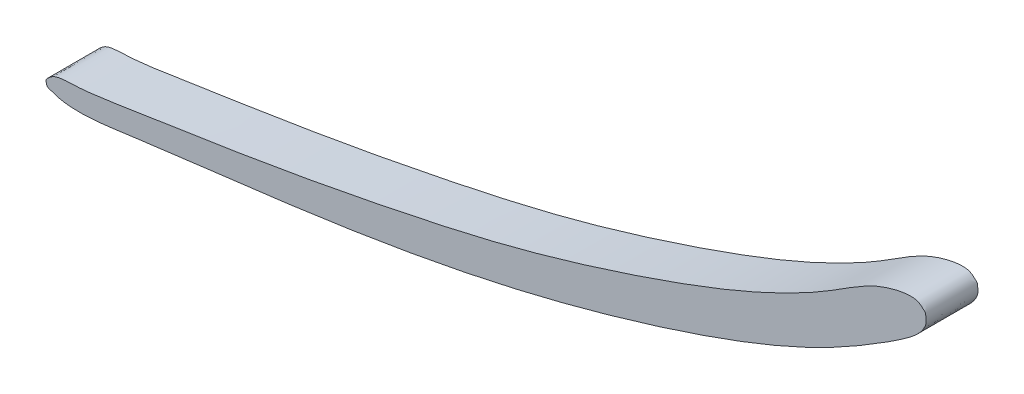
ISO-10303-21;
HEADER;
FILE_DESCRIPTION(('STEP AP214'),'2;1');
FILE_NAME('part.step','',(''),(''),'','','');
FILE_SCHEMA(('AUTOMOTIVE_DESIGN { 1 0 10303 214 1 1 1 1 }'));
ENDSEC;
DATA;
#1=APPLICATION_CONTEXT('core data for automotive mechanical design processes');
#2=APPLICATION_PROTOCOL_DEFINITION('international standard','automotive_design',2000,#1);
#3=PRODUCT_CONTEXT('',#1,'mechanical');
#4=PRODUCT('Part','Part','',(#3));
#5=PRODUCT_RELATED_PRODUCT_CATEGORY('part','',(#4));
#6=PRODUCT_DEFINITION_FORMATION('','',#4);
#7=PRODUCT_DEFINITION_CONTEXT('part definition',#1,'design');
#8=PRODUCT_DEFINITION('design','',#6,#7);
#9=PRODUCT_DEFINITION_SHAPE('','',#8);
#10=(LENGTH_UNIT() NAMED_UNIT(*) SI_UNIT(.MILLI.,.METRE.));
#11=(NAMED_UNIT(*) PLANE_ANGLE_UNIT() SI_UNIT($,.RADIAN.));
#12=(NAMED_UNIT(*) SI_UNIT($,.STERADIAN.) SOLID_ANGLE_UNIT());
#13=UNCERTAINTY_MEASURE_WITH_UNIT(LENGTH_MEASURE(1.E-05),#10,'distance_accuracy_value','');
#14=(GEOMETRIC_REPRESENTATION_CONTEXT(3) GLOBAL_UNCERTAINTY_ASSIGNED_CONTEXT((#13)) GLOBAL_UNIT_ASSIGNED_CONTEXT((#10,
#11,#12)) REPRESENTATION_CONTEXT('',''));
#15=CARTESIAN_POINT('',(0.,0.,0.));
#16=DIRECTION('',(0.,0.,1.));
#17=DIRECTION('',(1.,0.,0.));
#18=AXIS2_PLACEMENT_3D('',#15,#16,#17);
#19=CARTESIAN_POINT('',(81.9546405820367,0.,316.));
#20=CARTESIAN_POINT('',(81.9182748863016,0.089243312207409,316.));
#21=CARTESIAN_POINT('',(81.8518161970342,0.158823015412697,316.));
#22=CARTESIAN_POINT('',(81.7140613273951,0.28980377412269,316.));
#23=CARTESIAN_POINT('',(81.6414077026254,0.351049892688419,316.));
#24=CARTESIAN_POINT('',(81.4273001364999,0.539119186460483,316.));
#25=CARTESIAN_POINT('',(81.2851102193728,0.666832228059657,316.));
#26=CARTESIAN_POINT('',(81.0541309459078,0.830339589560085,316.));
#27=CARTESIAN_POINT('',(80.9746396369831,0.880572125893839,316.));
#28=CARTESIAN_POINT('',(80.8066057316116,0.965566869492166,316.));
#29=CARTESIAN_POINT('',(80.7176492036525,1.00096591970116,316.));
#30=CARTESIAN_POINT('',(80.4442176868888,1.0865491488962,316.));
#31=CARTESIAN_POINT('',(80.257755446291,1.11568194798233,316.));
#32=CARTESIAN_POINT('',(79.8807960284188,1.14695878573351,316.));
#33=CARTESIAN_POINT('',(79.6897614554825,1.14825299362697,316.));
#34=CARTESIAN_POINT('',(79.3121434621591,1.1369019626033,316.));
#35=CARTESIAN_POINT('',(79.1244636799543,1.12376938458255,316.));
#36=CARTESIAN_POINT('',(78.5644534405324,1.06436815026517,316.));
#37=CARTESIAN_POINT('',(78.1948995007169,0.999764036346694,316.));
#38=CARTESIAN_POINT('',(77.0917144194995,0.769784623696374,316.));
#39=CARTESIAN_POINT('',(76.3630574915217,0.562113818002702,316.));
#40=CARTESIAN_POINT('',(74.9508314190548,0.0730764678105502,316.));
#41=CARTESIAN_POINT('',(74.26363608331,-0.211904237510834,316.));
#42=CARTESIAN_POINT('',(72.2564212772526,-1.18313792848577,316.));
#43=CARTESIAN_POINT('',(70.9856052221877,-1.97567169653404,316.));
#44=CARTESIAN_POINT('',(69.0891814086041,-3.18155194632378,316.));
#45=CARTESIAN_POINT('',(68.4578603753768,-3.58501458001692,316.));
#46=CARTESIAN_POINT('',(67.1870663139028,-4.37700664007789,316.));
#47=CARTESIAN_POINT('',(66.5482682396617,-4.76677247889148,316.));
#48=CARTESIAN_POINT('',(64.6136481066863,-5.90268291697414,316.));
#49=CARTESIAN_POINT('',(63.3003898823765,-6.61688712927297,316.));
#50=CARTESIAN_POINT('',(60.6423566265034,-7.98756158619398,316.));
#51=CARTESIAN_POINT('',(59.2977079012692,-8.64426320468175,316.));
#52=CARTESIAN_POINT('',(56.5850021916112,-9.91478609313226,316.));
#53=CARTESIAN_POINT('',(55.2161519692049,-10.5275094282811,316.));
#54=CARTESIAN_POINT('',(52.4607548526107,-11.7063218833299,316.));
#55=CARTESIAN_POINT('',(51.0737063189857,-12.2734188886772,316.));
#56=CARTESIAN_POINT('',(46.8904747757466,-13.9220124185865,316.));
#57=CARTESIAN_POINT('',(44.076698288708,-14.9539924601354,316.));
#58=CARTESIAN_POINT('',(38.4208123807373,-16.9342289141329,316.));
#59=CARTESIAN_POINT('',(35.5768772184751,-17.8804869938995,316.));
#60=CARTESIAN_POINT('',(29.8655084025482,-19.69971173678,316.));
#61=CARTESIAN_POINT('',(26.9989195894682,-20.5722516853524,316.));
#62=CARTESIAN_POINT('',(21.2370655887499,-22.2198386268903,316.));
#63=CARTESIAN_POINT('',(18.3401274905242,-22.9927702561316,316.));
#64=CARTESIAN_POINT('',(12.5221282133524,-24.4330477982873,316.));
#65=CARTESIAN_POINT('',(9.60111202208722,-25.1014490657933,316.));
#66=CARTESIAN_POINT('',(3.74485255911519,-26.3769966265363,316.));
#67=CARTESIAN_POINT('',(0.810059324670765,-26.9864102959573,316.));
#68=CARTESIAN_POINT('',(-5.06636521183211,-28.1671176099954,316.));
#69=CARTESIAN_POINT('',(-8.00870948889032,-28.7364400779835,316.));
#70=CARTESIAN_POINT('',(-13.9023139259415,-29.8297047574911,316.));
#71=CARTESIAN_POINT('',(-16.8539693829938,-30.3499524586221,316.));
#72=CARTESIAN_POINT('',(-22.7644107992125,-31.3459919273104,316.));
#73=CARTESIAN_POINT('',(-25.7234844405557,-31.8211740457049,316.));
#74=CARTESIAN_POINT('',(-31.64517907339,-32.7502079600499,316.));
#75=CARTESIAN_POINT('',(-34.6072705800471,-33.2067619149209,316.));
#76=CARTESIAN_POINT('',(-39.0513443409814,-33.8854239793102,316.));
#77=CARTESIAN_POINT('',(-40.5329354700353,-34.1101506712477,316.));
#78=CARTESIAN_POINT('',(-42.7565096618807,-34.4392211476341,316.));
#79=CARTESIAN_POINT('',(-43.4978561517697,-34.5478895747197,316.));
#80=CARTESIAN_POINT('',(-44.9807394355377,-34.7638317834205,316.));
#81=CARTESIAN_POINT('',(-45.7223704155188,-34.8702725433276,316.));
#82=CARTESIAN_POINT('',(-47.2099154760837,-35.0485354665235,316.));
#83=CARTESIAN_POINT('',(-47.9563384145035,-35.1189865169633,316.));
#84=CARTESIAN_POINT('',(-49.0791279025362,-35.1869540484841,316.));
#85=CARTESIAN_POINT('',(-49.4541056796109,-35.2008332247413,316.));
#86=CARTESIAN_POINT('',(-50.2041050596801,-35.2280533211948,316.));
#87=CARTESIAN_POINT('',(-50.578902186492,-35.2441511867357,316.));
#88=CARTESIAN_POINT('',(-51.1387937127097,-35.2965969971684,316.));
#89=CARTESIAN_POINT('',(-51.3250580091422,-35.3185766374869,316.));
#90=CARTESIAN_POINT('',(-51.6962975668631,-35.3783674393037,316.));
#91=CARTESIAN_POINT('',(-51.8824258111486,-35.4168378541217,316.));
#92=CARTESIAN_POINT('',(-52.2463123768913,-35.5219532779401,316.));
#93=CARTESIAN_POINT('',(-52.4230074837365,-35.5882609488944,316.));
#94=CARTESIAN_POINT('',(-52.7606039163099,-35.7622552084388,316.));
#95=CARTESIAN_POINT('',(-52.918061103166,-35.8692218489668,316.));
#96=CARTESIAN_POINT('',(-53.1415131522069,-36.0435522658209,316.));
#97=CARTESIAN_POINT('',(-53.2136646977764,-36.1047903655575,316.));
#98=CARTESIAN_POINT('',(-53.3570929981775,-36.2284397034681,316.));
#99=CARTESIAN_POINT('',(-53.4293280627828,-36.2899539624756,316.));
#100=CARTESIAN_POINT('',(-53.5648051688221,-36.4218927887926,316.));
#101=CARTESIAN_POINT('',(-53.6312600227741,-36.4927538659897,316.));
#102=CARTESIAN_POINT('',(-53.7094628584896,-36.6645865581047,316.));
#103=CARTESIAN_POINT('',(-53.7137862045524,-36.7640328475197,316.));
#104=CARTESIAN_POINT('',(-53.6918197112169,-36.951135913176,316.));
#105=CARTESIAN_POINT('',(-53.6695753615207,-37.0422509078683,316.));
#106=CARTESIAN_POINT('',(-53.6180091447266,-37.2229495516098,316.));
#107=CARTESIAN_POINT('',(-53.5876519694081,-37.3133451174461,316.));
#108=CARTESIAN_POINT('',(-53.4881675673286,-37.4738966928527,316.));
#109=CARTESIAN_POINT('',(-53.4143216159522,-37.5388870191155,316.));
#110=CARTESIAN_POINT('',(-53.2445843828593,-37.6183572854478,316.));
#111=CARTESIAN_POINT('',(-53.1517814998787,-37.6406610261997,316.));
#112=CARTESIAN_POINT('',(-52.8786158688037,-37.7161915074091,316.));
#113=CARTESIAN_POINT('',(-52.6985739208244,-37.7732157035082,316.));
#114=CARTESIAN_POINT('',(-52.3408840894491,-37.894984626883,316.));
#115=CARTESIAN_POINT('',(-52.1623456221943,-37.9572349471845,316.));
#116=CARTESIAN_POINT('',(-51.6224224525606,-38.1201296416042,316.));
#117=CARTESIAN_POINT('',(-51.2564349398305,-38.194565698396,316.));
#118=CARTESIAN_POINT('',(-50.5177985076247,-38.3057550131267,316.));
#119=CARTESIAN_POINT('',(-50.1454426264057,-38.3441659542109,316.));
#120=CARTESIAN_POINT('',(-49.396792019221,-38.3987062523276,316.));
#121=CARTESIAN_POINT('',(-49.0206958101248,-38.4133646020394,316.));
#122=CARTESIAN_POINT('',(-47.8971625980423,-38.4237892955912,316.));
#123=CARTESIAN_POINT('',(-47.1507676794142,-38.3854628749226,316.));
#124=CARTESIAN_POINT('',(-45.6605345267884,-38.2647494353492,316.));
#125=CARTESIAN_POINT('',(-44.9166266074145,-38.1835633386593,316.));
#126=CARTESIAN_POINT('',(-42.6864719270234,-37.9129643636809,316.));
#127=CARTESIAN_POINT('',(-41.2032124696045,-37.7031991413411,316.));
#128=CARTESIAN_POINT('',(-38.2352272508575,-37.297415798383,316.));
#129=CARTESIAN_POINT('',(-36.7506967263939,-37.0986577341135,316.));
#130=CARTESIAN_POINT('',(-32.2941491778163,-36.5250987254802,316.));
#131=CARTESIAN_POINT('',(-29.3196978320326,-36.1690084095844,316.));
#132=CARTESIAN_POINT('',(-23.3721065437422,-35.4467611871817,316.));
#133=CARTESIAN_POINT('',(-20.3989508292782,-35.0806988714863,316.));
#134=CARTESIAN_POINT('',(-11.4880914751171,-33.9160806763925,316.));
#135=CARTESIAN_POINT('',(-5.55767157625974,-33.0502360842342,316.));
#136=CARTESIAN_POINT('',(6.25061971561724,-31.0320649081213,316.));
#137=CARTESIAN_POINT('',(12.1331890129808,-29.8825999895087,316.));
#138=CARTESIAN_POINT('',(23.8163007385662,-27.2176492195766,316.));
#139=CARTESIAN_POINT('',(29.6172490807749,-25.7011080353402,316.));
#140=CARTESIAN_POINT('',(38.2406645762647,-23.171772680002,316.));
#141=CARTESIAN_POINT('',(41.1014914808218,-22.2871241603912,316.));
#142=CARTESIAN_POINT('',(46.7930028004942,-20.4260699020948,316.));
#143=CARTESIAN_POINT('',(49.6236881394778,-19.4496669757709,316.));
#144=CARTESIAN_POINT('',(55.2404000871695,-17.3609147904409,316.));
#145=CARTESIAN_POINT('',(58.0245333898623,-16.2492782869261,316.));
#146=CARTESIAN_POINT('',(63.5035986793167,-13.8252918273535,316.));
#147=CARTESIAN_POINT('',(66.2001991823123,-12.5099449999535,316.));
#148=CARTESIAN_POINT('',(71.4667487740549,-9.64830298934935,316.));
#149=CARTESIAN_POINT('',(74.0386839902692,-8.10252610514831,316.));
#150=CARTESIAN_POINT('',(77.1826155149788,-6.06335085918845,316.));
#151=CARTESIAN_POINT('',(77.8081278326848,-5.65003968220255,316.));
#152=CARTESIAN_POINT('',(78.7320229738586,-5.00978704513141,316.));
#153=CARTESIAN_POINT('',(79.0370378318316,-4.79218083479674,316.));
#154=CARTESIAN_POINT('',(79.6370462210264,-4.34274018134626,316.));
#155=CARTESIAN_POINT('',(79.9322908925766,-4.11185112899191,316.));
#156=CARTESIAN_POINT('',(80.4987500584054,-3.62524435154558,316.));
#157=CARTESIAN_POINT('',(80.7702540175255,-3.36938112538204,316.));
#158=CARTESIAN_POINT('',(81.2725352019993,-2.81403045616466,316.));
#159=CARTESIAN_POINT('',(81.5023709687073,-2.51150877752152,316.));
#160=CARTESIAN_POINT('',(81.7830396426459,-2.0248548901506,316.));
#161=CARTESIAN_POINT('',(81.8672725857317,-1.85588105863238,316.));
#162=CARTESIAN_POINT('',(81.999105231837,-1.5013745114067,316.));
#163=CARTESIAN_POINT('',(82.0463519176487,-1.31982068387867,316.));
#164=CARTESIAN_POINT('',(82.0716351434549,-0.940770460698717,316.));
#165=CARTESIAN_POINT('',(82.0458641107979,-0.751092051566451,316.));
#166=CARTESIAN_POINT('',(82.0124105837043,-0.468344785746741,316.));
#167=CARTESIAN_POINT('',(82.005397647586,-0.373782145218598,316.));
#168=CARTESIAN_POINT('',(81.993306477084,-0.184510272976822,316.));
#169=CARTESIAN_POINT('',(81.9910062777718,-0.0892433122073938,316.));
#170=CARTESIAN_POINT('',(81.9546405820367,0.,316.));
#171=B_SPLINE_CURVE_WITH_KNOTS('',3,(#19,#20,#21,#22,#23,#24,#25,#26,#27,#28,#29,#30,#31,#32,
#33,#34,#35,#36,#37,#38,#39,#40,#41,#42,#43,#44,#45,#46,#47,#48,#49,#50,#51,#52,#53,#54,#55,#56,
#57,#58,#59,#60,#61,#62,#63,#64,#65,#66,#67,#68,#69,#70,#71,#72,#73,#74,#75,#76,#77,#78,#79,#80,
#81,#82,#83,#84,#85,#86,#87,#88,#89,#90,#91,#92,#93,#94,#95,#96,#97,#98,#99,#100,#101,#102,#103,
#104,#105,#106,#107,#108,#109,#110,#111,#112,#113,#114,#115,#116,#117,#118,#119,#120,#121,#122,
#123,#124,#125,#126,#127,#128,#129,#130,#131,#132,#133,#134,#135,#136,#137,#138,#139,#140,#141,
#142,#143,#144,#145,#146,#147,#148,#149,#150,#151,#152,#153,#154,#155,#156,#157,#158,#159,#160,
#161,#162,#163,#164,#165,#166,#167,#168,#169,#170),.UNSPECIFIED.,.T.,.F.,(4,2,2,2,2,2,2,2,2,2,2,
2,2,2,2,2,2,2,2,2,2,2,2,2,2,2,2,2,2,2,2,2,2,2,2,2,2,2,2,2,2,2,2,2,2,2,2,2,2,2,2,2,2,2,2,2,2,2,2,
2,2,2,2,2,2,2,2,2,2,2,2,2,2,2,2,4),(0.,0.000976562500000057,0.00195312500000011,
0.00390625000000023,0.00488281250000028,0.00585937500000034,0.00781250000000045,
0.00976562500000057,0.0117187500000007,0.0156250000000008,0.0234375000000008,0.0312500000000008,
0.0468750000000009,0.0546875000000009,0.0625000000000009,0.0781250000000011,0.0937500000000013,
0.109375000000002,0.125000000000002,0.156250000000002,0.187500000000003,0.218750000000003,
0.250000000000004,0.281250000000004,0.312500000000005,0.343750000000005,0.375000000000005,
0.406250000000006,0.437500000000006,0.453125000000007,0.460937500000007,0.468750000000007,
0.476562500000007,0.480468750000007,0.484375000000007,0.486328125000007,0.488281250000007,
0.490234375000007,0.492187500000007,0.493164062500007,0.494140625000007,0.495117187500007,
0.496093750000006,0.497070312500006,0.498046875000006,0.499023437500006,0.500000000000006,
0.501953125000006,0.503906250000006,0.507812500000006,0.511718750000006,0.515625000000006,
0.523437500000006,0.531250000000006,0.546875000000006,0.562500000000006,0.593750000000005,
0.625000000000005,0.687500000000004,0.750000000000003,0.812500000000002,0.843750000000002,
0.875000000000001,0.906250000000001,0.9375,0.96875,0.9765625,0.98046875,0.984375,0.98828125,
0.9921875,0.994140625,0.99609375,0.998046875,0.9990234375,1.),.UNSPECIFIED.);
#172=DIRECTION('',(0.,0.,-1.));
#173=VECTOR('',#172,1.);
#174=SURFACE_OF_LINEAR_EXTRUSION('',#171,#173);
#175=CARTESIAN_POINT('',(81.9546405820367,0.,316.));
#176=CARTESIAN_POINT('',(81.9910062777718,-0.0892433122073938,316.));
#177=CARTESIAN_POINT('',(81.993306477084,-0.184510272976822,316.));
#178=CARTESIAN_POINT('',(82.005397647586,-0.373782145218598,316.));
#179=CARTESIAN_POINT('',(82.0124105837043,-0.468344785746741,316.));
#180=CARTESIAN_POINT('',(82.0458641107979,-0.751092051566451,316.));
#181=CARTESIAN_POINT('',(82.0716351434549,-0.940770460698717,316.));
#182=CARTESIAN_POINT('',(82.0463519176487,-1.31982068387867,316.));
#183=CARTESIAN_POINT('',(81.999105231837,-1.5013745114067,316.));
#184=CARTESIAN_POINT('',(81.8672725857317,-1.85588105863238,316.));
#185=CARTESIAN_POINT('',(81.7830396426459,-2.0248548901506,316.));
#186=CARTESIAN_POINT('',(81.5023709687073,-2.51150877752152,316.));
#187=CARTESIAN_POINT('',(81.2725352019993,-2.81403045616466,316.));
#188=CARTESIAN_POINT('',(80.7702540175255,-3.36938112538204,316.));
#189=CARTESIAN_POINT('',(80.4987500584054,-3.62524435154558,316.));
#190=CARTESIAN_POINT('',(79.9322908925766,-4.11185112899191,316.));
#191=CARTESIAN_POINT('',(79.6370462210264,-4.34274018134626,316.));
#192=CARTESIAN_POINT('',(79.0370378318316,-4.79218083479674,316.));
#193=CARTESIAN_POINT('',(78.7320229738586,-5.00978704513141,316.));
#194=CARTESIAN_POINT('',(77.8081278326848,-5.65003968220255,316.));
#195=CARTESIAN_POINT('',(77.1826155149788,-6.06335085918845,316.));
#196=CARTESIAN_POINT('',(74.0386839902692,-8.10252610514831,316.));
#197=CARTESIAN_POINT('',(71.4667487740549,-9.64830298934935,316.));
#198=CARTESIAN_POINT('',(66.2001991823123,-12.5099449999535,316.));
#199=CARTESIAN_POINT('',(63.5035986793167,-13.8252918273535,316.));
#200=CARTESIAN_POINT('',(58.0245333898623,-16.2492782869261,316.));
#201=CARTESIAN_POINT('',(55.2404000871695,-17.3609147904409,316.));
#202=CARTESIAN_POINT('',(49.6236881394778,-19.4496669757709,316.));
#203=CARTESIAN_POINT('',(46.7930028004942,-20.4260699020948,316.));
#204=CARTESIAN_POINT('',(41.1014914808218,-22.2871241603912,316.));
#205=CARTESIAN_POINT('',(38.2406645762647,-23.171772680002,316.));
#206=CARTESIAN_POINT('',(29.6172490807749,-25.7011080353402,316.));
#207=CARTESIAN_POINT('',(23.8163007385662,-27.2176492195766,316.));
#208=CARTESIAN_POINT('',(12.1331890129808,-29.8825999895087,316.));
#209=CARTESIAN_POINT('',(6.25061971561724,-31.0320649081213,316.));
#210=CARTESIAN_POINT('',(-5.55767157625974,-33.0502360842342,316.));
#211=CARTESIAN_POINT('',(-11.4880914751171,-33.9160806763925,316.));
#212=CARTESIAN_POINT('',(-20.3989508292782,-35.0806988714863,316.));
#213=CARTESIAN_POINT('',(-23.3721065437422,-35.4467611871817,316.));
#214=CARTESIAN_POINT('',(-29.3196978320326,-36.1690084095844,316.));
#215=CARTESIAN_POINT('',(-32.2941491778163,-36.5250987254802,316.));
#216=CARTESIAN_POINT('',(-36.7506967263939,-37.0986577341135,316.));
#217=CARTESIAN_POINT('',(-38.2352272508575,-37.297415798383,316.));
#218=CARTESIAN_POINT('',(-41.2032124696045,-37.7031991413411,316.));
#219=CARTESIAN_POINT('',(-42.6864719270234,-37.9129643636809,316.));
#220=CARTESIAN_POINT('',(-44.9166266074145,-38.1835633386593,316.));
#221=CARTESIAN_POINT('',(-45.6605345267884,-38.2647494353492,316.));
#222=CARTESIAN_POINT('',(-47.1507676794142,-38.3854628749226,316.));
#223=CARTESIAN_POINT('',(-47.8971625980423,-38.4237892955912,316.));
#224=CARTESIAN_POINT('',(-49.0206958101248,-38.4133646020394,316.));
#225=CARTESIAN_POINT('',(-49.396792019221,-38.3987062523276,316.));
#226=CARTESIAN_POINT('',(-50.1454426264057,-38.3441659542109,316.));
#227=CARTESIAN_POINT('',(-50.5177985076247,-38.3057550131267,316.));
#228=CARTESIAN_POINT('',(-51.2564349398305,-38.194565698396,316.));
#229=CARTESIAN_POINT('',(-51.6224224525606,-38.1201296416042,316.));
#230=CARTESIAN_POINT('',(-52.1623456221943,-37.9572349471845,316.));
#231=CARTESIAN_POINT('',(-52.3408840894491,-37.894984626883,316.));
#232=CARTESIAN_POINT('',(-52.6985739208244,-37.7732157035082,316.));
#233=CARTESIAN_POINT('',(-52.8786158688037,-37.7161915074091,316.));
#234=CARTESIAN_POINT('',(-53.1517814998787,-37.6406610261997,316.));
#235=CARTESIAN_POINT('',(-53.2445843828593,-37.6183572854478,316.));
#236=CARTESIAN_POINT('',(-53.4143216159522,-37.5388870191155,316.));
#237=CARTESIAN_POINT('',(-53.4881675673286,-37.4738966928527,316.));
#238=CARTESIAN_POINT('',(-53.5876519694081,-37.3133451174461,316.));
#239=CARTESIAN_POINT('',(-53.6180091447266,-37.2229495516098,316.));
#240=CARTESIAN_POINT('',(-53.6695753615207,-37.0422509078683,316.));
#241=CARTESIAN_POINT('',(-53.6918197112169,-36.951135913176,316.));
#242=CARTESIAN_POINT('',(-53.7137862045524,-36.7640328475197,316.));
#243=CARTESIAN_POINT('',(-53.7094628584896,-36.6645865581047,316.));
#244=CARTESIAN_POINT('',(-53.6312600227741,-36.4927538659897,316.));
#245=CARTESIAN_POINT('',(-53.5648051688221,-36.4218927887926,316.));
#246=CARTESIAN_POINT('',(-53.4293280627828,-36.2899539624756,316.));
#247=CARTESIAN_POINT('',(-53.3570929981775,-36.2284397034681,316.));
#248=CARTESIAN_POINT('',(-53.2136646977764,-36.1047903655575,316.));
#249=CARTESIAN_POINT('',(-53.1415131522069,-36.0435522658209,316.));
#250=CARTESIAN_POINT('',(-52.918061103166,-35.8692218489668,316.));
#251=CARTESIAN_POINT('',(-52.7606039163099,-35.7622552084388,316.));
#252=CARTESIAN_POINT('',(-52.4230074837365,-35.5882609488944,316.));
#253=CARTESIAN_POINT('',(-52.2463123768913,-35.5219532779401,316.));
#254=CARTESIAN_POINT('',(-51.8824258111486,-35.4168378541217,316.));
#255=CARTESIAN_POINT('',(-51.6962975668631,-35.3783674393037,316.));
#256=CARTESIAN_POINT('',(-51.3250580091422,-35.3185766374869,316.));
#257=CARTESIAN_POINT('',(-51.1387937127097,-35.2965969971684,316.));
#258=CARTESIAN_POINT('',(-50.578902186492,-35.2441511867357,316.));
#259=CARTESIAN_POINT('',(-50.2041050596801,-35.2280533211948,316.));
#260=CARTESIAN_POINT('',(-49.4541056796109,-35.2008332247413,316.));
#261=CARTESIAN_POINT('',(-49.0791279025362,-35.1869540484841,316.));
#262=CARTESIAN_POINT('',(-47.9563384145035,-35.1189865169633,316.));
#263=CARTESIAN_POINT('',(-47.2099154760837,-35.0485354665235,316.));
#264=CARTESIAN_POINT('',(-45.7223704155188,-34.8702725433276,316.));
#265=CARTESIAN_POINT('',(-44.9807394355377,-34.7638317834205,316.));
#266=CARTESIAN_POINT('',(-43.4978561517697,-34.5478895747197,316.));
#267=CARTESIAN_POINT('',(-42.7565096618807,-34.4392211476341,316.));
#268=CARTESIAN_POINT('',(-40.5329354700353,-34.1101506712477,316.));
#269=CARTESIAN_POINT('',(-39.0513443409814,-33.8854239793102,316.));
#270=CARTESIAN_POINT('',(-34.6072705800471,-33.2067619149209,316.));
#271=CARTESIAN_POINT('',(-31.64517907339,-32.7502079600499,316.));
#272=CARTESIAN_POINT('',(-25.7234844405557,-31.8211740457049,316.));
#273=CARTESIAN_POINT('',(-22.7644107992125,-31.3459919273104,316.));
#274=CARTESIAN_POINT('',(-16.8539693829938,-30.3499524586221,316.));
#275=CARTESIAN_POINT('',(-13.9023139259415,-29.8297047574911,316.));
#276=CARTESIAN_POINT('',(-8.00870948889032,-28.7364400779835,316.));
#277=CARTESIAN_POINT('',(-5.06636521183211,-28.1671176099954,316.));
#278=CARTESIAN_POINT('',(0.810059324670765,-26.9864102959573,316.));
#279=CARTESIAN_POINT('',(3.74485255911519,-26.3769966265363,316.));
#280=CARTESIAN_POINT('',(9.60111202208722,-25.1014490657933,316.));
#281=CARTESIAN_POINT('',(12.5221282133524,-24.4330477982873,316.));
#282=CARTESIAN_POINT('',(18.3401274905242,-22.9927702561316,316.));
#283=CARTESIAN_POINT('',(21.2370655887499,-22.2198386268903,316.));
#284=CARTESIAN_POINT('',(26.9989195894682,-20.5722516853524,316.));
#285=CARTESIAN_POINT('',(29.8655084025482,-19.69971173678,316.));
#286=CARTESIAN_POINT('',(35.5768772184751,-17.8804869938995,316.));
#287=CARTESIAN_POINT('',(38.4208123807373,-16.9342289141329,316.));
#288=CARTESIAN_POINT('',(44.076698288708,-14.9539924601354,316.));
#289=CARTESIAN_POINT('',(46.8904747757466,-13.9220124185865,316.));
#290=CARTESIAN_POINT('',(51.0737063189857,-12.2734188886772,316.));
#291=CARTESIAN_POINT('',(52.4607548526107,-11.7063218833299,316.));
#292=CARTESIAN_POINT('',(55.2161519692049,-10.5275094282811,316.));
#293=CARTESIAN_POINT('',(56.5850021916112,-9.91478609313226,316.));
#294=CARTESIAN_POINT('',(59.2977079012692,-8.64426320468175,316.));
#295=CARTESIAN_POINT('',(60.6423566265034,-7.98756158619398,316.));
#296=CARTESIAN_POINT('',(63.3003898823765,-6.61688712927297,316.));
#297=CARTESIAN_POINT('',(64.6136481066863,-5.90268291697414,316.));
#298=CARTESIAN_POINT('',(66.5482682396617,-4.76677247889148,316.));
#299=CARTESIAN_POINT('',(67.1870663139028,-4.37700664007789,316.));
#300=CARTESIAN_POINT('',(68.4578603753768,-3.58501458001692,316.));
#301=CARTESIAN_POINT('',(69.0891814086041,-3.18155194632378,316.));
#302=CARTESIAN_POINT('',(70.9856052221877,-1.97567169653404,316.));
#303=CARTESIAN_POINT('',(72.2564212772526,-1.18313792848577,316.));
#304=CARTESIAN_POINT('',(74.26363608331,-0.211904237510834,316.));
#305=CARTESIAN_POINT('',(74.9508314190548,0.0730764678105502,316.));
#306=CARTESIAN_POINT('',(76.3630574915217,0.562113818002702,316.));
#307=CARTESIAN_POINT('',(77.0917144194995,0.769784623696374,316.));
#308=CARTESIAN_POINT('',(78.1948995007169,0.999764036346694,316.));
#309=CARTESIAN_POINT('',(78.5644534405324,1.06436815026517,316.));
#310=CARTESIAN_POINT('',(79.1244636799543,1.12376938458255,316.));
#311=CARTESIAN_POINT('',(79.3121434621591,1.1369019626033,316.));
#312=CARTESIAN_POINT('',(79.6897614554825,1.14825299362697,316.));
#313=CARTESIAN_POINT('',(79.8807960284188,1.14695878573351,316.));
#314=CARTESIAN_POINT('',(80.257755446291,1.11568194798233,316.));
#315=CARTESIAN_POINT('',(80.4442176868888,1.0865491488962,316.));
#316=CARTESIAN_POINT('',(80.7176492036525,1.00096591970116,316.));
#317=CARTESIAN_POINT('',(80.8066057316116,0.965566869492166,316.));
#318=CARTESIAN_POINT('',(80.9746396369831,0.880572125893839,316.));
#319=CARTESIAN_POINT('',(81.0541309459078,0.830339589560085,316.));
#320=CARTESIAN_POINT('',(81.2851102193728,0.666832228059657,316.));
#321=CARTESIAN_POINT('',(81.4273001364999,0.539119186460483,316.));
#322=CARTESIAN_POINT('',(81.6414077026254,0.351049892688419,316.));
#323=CARTESIAN_POINT('',(81.7140613273951,0.28980377412269,316.));
#324=CARTESIAN_POINT('',(81.8518161970342,0.158823015412697,316.));
#325=CARTESIAN_POINT('',(81.9182748863016,0.089243312207409,316.));
#326=CARTESIAN_POINT('',(81.9546405820367,0.,316.));
#327=B_SPLINE_CURVE_WITH_KNOTS('',3,(#175,#176,#177,#178,#179,#180,#181,#182,#183,#184,#185,
#186,#187,#188,#189,#190,#191,#192,#193,#194,#195,#196,#197,#198,#199,#200,#201,#202,#203,#204,
#205,#206,#207,#208,#209,#210,#211,#212,#213,#214,#215,#216,#217,#218,#219,#220,#221,#222,#223,
#224,#225,#226,#227,#228,#229,#230,#231,#232,#233,#234,#235,#236,#237,#238,#239,#240,#241,#242,
#243,#244,#245,#246,#247,#248,#249,#250,#251,#252,#253,#254,#255,#256,#257,#258,#259,#260,#261,
#262,#263,#264,#265,#266,#267,#268,#269,#270,#271,#272,#273,#274,#275,#276,#277,#278,#279,#280,
#281,#282,#283,#284,#285,#286,#287,#288,#289,#290,#291,#292,#293,#294,#295,#296,#297,#298,#299,
#300,#301,#302,#303,#304,#305,#306,#307,#308,#309,#310,#311,#312,#313,#314,#315,#316,#317,#318,
#319,#320,#321,#322,#323,#324,#325,#326),.UNSPECIFIED.,.T.,.F.,(4,2,2,2,2,2,2,2,2,2,2,2,2,2,2,2,
2,2,2,2,2,2,2,2,2,2,2,2,2,2,2,2,2,2,2,2,2,2,2,2,2,2,2,2,2,2,2,2,2,2,2,2,2,2,2,2,2,2,2,2,2,2,2,2,
2,2,2,2,2,2,2,2,2,2,2,4),(0.,0.000976562500000111,0.00195312500000011,0.00390625000000011,
0.00585937500000011,0.00781250000000011,0.0117187500000001,0.0156250000000001,
0.0195312500000001,0.0234375000000001,0.03125,0.0624999999999996,0.093749999999999,
0.124999999999999,0.156249999999998,0.187499999999998,0.249999999999997,0.312499999999996,
0.374999999999995,0.406249999999995,0.437499999999994,0.453124999999994,0.468749999999994,
0.476562499999994,0.484374999999994,0.488281249999994,0.492187499999994,0.496093749999994,
0.498046874999994,0.499999999999994,0.500976562499994,0.501953124999994,0.502929687499994,
0.503906249999994,0.504882812499993,0.505859374999993,0.506835937499993,0.507812499999993,
0.509765624999993,0.511718749999993,0.513671874999993,0.515624999999993,0.519531249999993,
0.523437499999993,0.531249999999993,0.539062499999993,0.546874999999993,0.562499999999994,
0.593749999999994,0.624999999999995,0.656249999999995,0.687499999999995,0.718749999999996,
0.749999999999996,0.781249999999997,0.812499999999997,0.843749999999998,0.874999999999998,
0.890624999999998,0.906249999999999,0.921874999999999,0.937499999999999,0.945312499999999,
0.953124999999999,0.968749999999999,0.976562499999999,0.984374999999999,0.988281249999999,
0.990234374999999,0.9921875,0.994140625,0.9951171875,0.99609375,0.998046875,0.9990234375,1.),.UNSPECIFIED.);
#328=CARTESIAN_POINT('',(81.9546405820367,0.,316.));
#329=VERTEX_POINT('',#328);
#330=EDGE_CURVE('E10',#329,#329,#327,.F.);
#331=ORIENTED_EDGE('',*,*,#330,.F.);
#332=EDGE_LOOP('',(#331));
#333=FACE_BOUND('',#332,.T.);
#334=CARTESIAN_POINT('',(81.9546405820367,0.,308.));
#335=CARTESIAN_POINT('',(81.9182748863016,0.089243312207409,308.));
#336=CARTESIAN_POINT('',(81.8518161970342,0.158823015412697,308.));
#337=CARTESIAN_POINT('',(81.7140613273951,0.28980377412269,308.));
#338=CARTESIAN_POINT('',(81.6414077026254,0.351049892688419,308.));
#339=CARTESIAN_POINT('',(81.4273001364999,0.539119186460483,308.));
#340=CARTESIAN_POINT('',(81.2851102193728,0.666832228059657,308.));
#341=CARTESIAN_POINT('',(81.0541309459078,0.830339589560085,308.));
#342=CARTESIAN_POINT('',(80.9746396369831,0.880572125893839,308.));
#343=CARTESIAN_POINT('',(80.8066057316116,0.965566869492166,308.));
#344=CARTESIAN_POINT('',(80.7176492036525,1.00096591970116,308.));
#345=CARTESIAN_POINT('',(80.4442176868888,1.0865491488962,308.));
#346=CARTESIAN_POINT('',(80.257755446291,1.11568194798233,308.));
#347=CARTESIAN_POINT('',(79.8807960284188,1.14695878573351,308.));
#348=CARTESIAN_POINT('',(79.6897614554825,1.14825299362697,308.));
#349=CARTESIAN_POINT('',(79.3121434621591,1.1369019626033,308.));
#350=CARTESIAN_POINT('',(79.1244636799543,1.12376938458255,308.));
#351=CARTESIAN_POINT('',(78.5644534405324,1.06436815026517,308.));
#352=CARTESIAN_POINT('',(78.1948995007169,0.999764036346694,308.));
#353=CARTESIAN_POINT('',(77.0917144194995,0.769784623696374,308.));
#354=CARTESIAN_POINT('',(76.3630574915217,0.562113818002702,308.));
#355=CARTESIAN_POINT('',(74.9508314190548,0.0730764678105502,308.));
#356=CARTESIAN_POINT('',(74.26363608331,-0.211904237510834,308.));
#357=CARTESIAN_POINT('',(72.2564212772526,-1.18313792848577,308.));
#358=CARTESIAN_POINT('',(70.9856052221877,-1.97567169653404,308.));
#359=CARTESIAN_POINT('',(69.0891814086041,-3.18155194632378,308.));
#360=CARTESIAN_POINT('',(68.4578603753768,-3.58501458001692,308.));
#361=CARTESIAN_POINT('',(67.1870663139028,-4.37700664007789,308.));
#362=CARTESIAN_POINT('',(66.5482682396617,-4.76677247889148,308.));
#363=CARTESIAN_POINT('',(64.6136481066863,-5.90268291697414,308.));
#364=CARTESIAN_POINT('',(63.3003898823765,-6.61688712927297,308.));
#365=CARTESIAN_POINT('',(60.6423566265034,-7.98756158619398,308.));
#366=CARTESIAN_POINT('',(59.2977079012692,-8.64426320468175,308.));
#367=CARTESIAN_POINT('',(56.5850021916112,-9.91478609313226,308.));
#368=CARTESIAN_POINT('',(55.2161519692049,-10.5275094282811,308.));
#369=CARTESIAN_POINT('',(52.4607548526107,-11.7063218833299,308.));
#370=CARTESIAN_POINT('',(51.0737063189857,-12.2734188886772,308.));
#371=CARTESIAN_POINT('',(46.8904747757466,-13.9220124185865,308.));
#372=CARTESIAN_POINT('',(44.076698288708,-14.9539924601354,308.));
#373=CARTESIAN_POINT('',(38.4208123807373,-16.9342289141329,308.));
#374=CARTESIAN_POINT('',(35.5768772184751,-17.8804869938995,308.));
#375=CARTESIAN_POINT('',(29.8655084025482,-19.69971173678,308.));
#376=CARTESIAN_POINT('',(26.9989195894682,-20.5722516853524,308.));
#377=CARTESIAN_POINT('',(21.2370655887499,-22.2198386268903,308.));
#378=CARTESIAN_POINT('',(18.3401274905242,-22.9927702561316,308.));
#379=CARTESIAN_POINT('',(12.5221282133524,-24.4330477982873,308.));
#380=CARTESIAN_POINT('',(9.60111202208722,-25.1014490657933,308.));
#381=CARTESIAN_POINT('',(3.74485255911519,-26.3769966265363,308.));
#382=CARTESIAN_POINT('',(0.810059324670765,-26.9864102959573,308.));
#383=CARTESIAN_POINT('',(-5.06636521183211,-28.1671176099954,308.));
#384=CARTESIAN_POINT('',(-8.00870948889032,-28.7364400779835,308.));
#385=CARTESIAN_POINT('',(-13.9023139259415,-29.8297047574911,308.));
#386=CARTESIAN_POINT('',(-16.8539693829938,-30.3499524586221,308.));
#387=CARTESIAN_POINT('',(-22.7644107992125,-31.3459919273104,308.));
#388=CARTESIAN_POINT('',(-25.7234844405557,-31.8211740457049,308.));
#389=CARTESIAN_POINT('',(-31.64517907339,-32.7502079600499,308.));
#390=CARTESIAN_POINT('',(-34.6072705800471,-33.2067619149209,308.));
#391=CARTESIAN_POINT('',(-39.0513443409814,-33.8854239793102,308.));
#392=CARTESIAN_POINT('',(-40.5329354700353,-34.1101506712477,308.));
#393=CARTESIAN_POINT('',(-42.7565096618807,-34.4392211476341,308.));
#394=CARTESIAN_POINT('',(-43.4978561517697,-34.5478895747197,308.));
#395=CARTESIAN_POINT('',(-44.9807394355377,-34.7638317834205,308.));
#396=CARTESIAN_POINT('',(-45.7223704155188,-34.8702725433276,308.));
#397=CARTESIAN_POINT('',(-47.2099154760837,-35.0485354665235,308.));
#398=CARTESIAN_POINT('',(-47.9563384145035,-35.1189865169633,308.));
#399=CARTESIAN_POINT('',(-49.0791279025362,-35.1869540484841,308.));
#400=CARTESIAN_POINT('',(-49.4541056796109,-35.2008332247413,308.));
#401=CARTESIAN_POINT('',(-50.2041050596801,-35.2280533211948,308.));
#402=CARTESIAN_POINT('',(-50.578902186492,-35.2441511867357,308.));
#403=CARTESIAN_POINT('',(-51.1387937127097,-35.2965969971684,308.));
#404=CARTESIAN_POINT('',(-51.3250580091422,-35.3185766374869,308.));
#405=CARTESIAN_POINT('',(-51.6962975668631,-35.3783674393037,308.));
#406=CARTESIAN_POINT('',(-51.8824258111486,-35.4168378541217,308.));
#407=CARTESIAN_POINT('',(-52.2463123768913,-35.5219532779401,308.));
#408=CARTESIAN_POINT('',(-52.4230074837365,-35.5882609488944,308.));
#409=CARTESIAN_POINT('',(-52.7606039163099,-35.7622552084388,308.));
#410=CARTESIAN_POINT('',(-52.918061103166,-35.8692218489668,308.));
#411=CARTESIAN_POINT('',(-53.1415131522069,-36.0435522658209,308.));
#412=CARTESIAN_POINT('',(-53.2136646977764,-36.1047903655575,308.));
#413=CARTESIAN_POINT('',(-53.3570929981775,-36.2284397034681,308.));
#414=CARTESIAN_POINT('',(-53.4293280627828,-36.2899539624756,308.));
#415=CARTESIAN_POINT('',(-53.5648051688221,-36.4218927887926,308.));
#416=CARTESIAN_POINT('',(-53.6312600227741,-36.4927538659897,308.));
#417=CARTESIAN_POINT('',(-53.7094628584896,-36.6645865581047,308.));
#418=CARTESIAN_POINT('',(-53.7137862045524,-36.7640328475197,308.));
#419=CARTESIAN_POINT('',(-53.6918197112169,-36.951135913176,308.));
#420=CARTESIAN_POINT('',(-53.6695753615207,-37.0422509078683,308.));
#421=CARTESIAN_POINT('',(-53.6180091447266,-37.2229495516098,308.));
#422=CARTESIAN_POINT('',(-53.5876519694081,-37.3133451174461,308.));
#423=CARTESIAN_POINT('',(-53.4881675673286,-37.4738966928527,308.));
#424=CARTESIAN_POINT('',(-53.4143216159522,-37.5388870191155,308.));
#425=CARTESIAN_POINT('',(-53.2445843828593,-37.6183572854478,308.));
#426=CARTESIAN_POINT('',(-53.1517814998787,-37.6406610261997,308.));
#427=CARTESIAN_POINT('',(-52.8786158688037,-37.7161915074091,308.));
#428=CARTESIAN_POINT('',(-52.6985739208244,-37.7732157035082,308.));
#429=CARTESIAN_POINT('',(-52.3408840894491,-37.894984626883,308.));
#430=CARTESIAN_POINT('',(-52.1623456221943,-37.9572349471845,308.));
#431=CARTESIAN_POINT('',(-51.6224224525606,-38.1201296416042,308.));
#432=CARTESIAN_POINT('',(-51.2564349398305,-38.194565698396,308.));
#433=CARTESIAN_POINT('',(-50.5177985076247,-38.3057550131267,308.));
#434=CARTESIAN_POINT('',(-50.1454426264057,-38.3441659542109,308.));
#435=CARTESIAN_POINT('',(-49.396792019221,-38.3987062523276,308.));
#436=CARTESIAN_POINT('',(-49.0206958101248,-38.4133646020394,308.));
#437=CARTESIAN_POINT('',(-47.8971625980423,-38.4237892955912,308.));
#438=CARTESIAN_POINT('',(-47.1507676794142,-38.3854628749226,308.));
#439=CARTESIAN_POINT('',(-45.6605345267884,-38.2647494353492,308.));
#440=CARTESIAN_POINT('',(-44.9166266074145,-38.1835633386593,308.));
#441=CARTESIAN_POINT('',(-42.6864719270234,-37.9129643636809,308.));
#442=CARTESIAN_POINT('',(-41.2032124696045,-37.7031991413411,308.));
#443=CARTESIAN_POINT('',(-38.2352272508575,-37.297415798383,308.));
#444=CARTESIAN_POINT('',(-36.7506967263939,-37.0986577341135,308.));
#445=CARTESIAN_POINT('',(-32.2941491778163,-36.5250987254802,308.));
#446=CARTESIAN_POINT('',(-29.3196978320326,-36.1690084095844,308.));
#447=CARTESIAN_POINT('',(-23.3721065437422,-35.4467611871817,308.));
#448=CARTESIAN_POINT('',(-20.3989508292782,-35.0806988714863,308.));
#449=CARTESIAN_POINT('',(-11.4880914751171,-33.9160806763925,308.));
#450=CARTESIAN_POINT('',(-5.55767157625974,-33.0502360842342,308.));
#451=CARTESIAN_POINT('',(6.25061971561724,-31.0320649081213,308.));
#452=CARTESIAN_POINT('',(12.1331890129808,-29.8825999895087,308.));
#453=CARTESIAN_POINT('',(23.8163007385662,-27.2176492195766,308.));
#454=CARTESIAN_POINT('',(29.6172490807749,-25.7011080353402,308.));
#455=CARTESIAN_POINT('',(38.2406645762647,-23.171772680002,308.));
#456=CARTESIAN_POINT('',(41.1014914808218,-22.2871241603912,308.));
#457=CARTESIAN_POINT('',(46.7930028004942,-20.4260699020948,308.));
#458=CARTESIAN_POINT('',(49.6236881394778,-19.4496669757709,308.));
#459=CARTESIAN_POINT('',(55.2404000871695,-17.3609147904409,308.));
#460=CARTESIAN_POINT('',(58.0245333898623,-16.2492782869261,308.));
#461=CARTESIAN_POINT('',(63.5035986793167,-13.8252918273535,308.));
#462=CARTESIAN_POINT('',(66.2001991823123,-12.5099449999535,308.));
#463=CARTESIAN_POINT('',(71.4667487740549,-9.64830298934935,308.));
#464=CARTESIAN_POINT('',(74.0386839902692,-8.10252610514831,308.));
#465=CARTESIAN_POINT('',(77.1826155149788,-6.06335085918845,308.));
#466=CARTESIAN_POINT('',(77.8081278326848,-5.65003968220255,308.));
#467=CARTESIAN_POINT('',(78.7320229738586,-5.00978704513141,308.));
#468=CARTESIAN_POINT('',(79.0370378318316,-4.79218083479674,308.));
#469=CARTESIAN_POINT('',(79.6370462210264,-4.34274018134626,308.));
#470=CARTESIAN_POINT('',(79.9322908925766,-4.11185112899191,308.));
#471=CARTESIAN_POINT('',(80.4987500584054,-3.62524435154558,308.));
#472=CARTESIAN_POINT('',(80.7702540175255,-3.36938112538204,308.));
#473=CARTESIAN_POINT('',(81.2725352019993,-2.81403045616466,308.));
#474=CARTESIAN_POINT('',(81.5023709687073,-2.51150877752152,308.));
#475=CARTESIAN_POINT('',(81.7830396426459,-2.0248548901506,308.));
#476=CARTESIAN_POINT('',(81.8672725857317,-1.85588105863238,308.));
#477=CARTESIAN_POINT('',(81.999105231837,-1.5013745114067,308.));
#478=CARTESIAN_POINT('',(82.0463519176487,-1.31982068387867,308.));
#479=CARTESIAN_POINT('',(82.0716351434549,-0.940770460698717,308.));
#480=CARTESIAN_POINT('',(82.0458641107979,-0.751092051566451,308.));
#481=CARTESIAN_POINT('',(82.0124105837043,-0.468344785746741,308.));
#482=CARTESIAN_POINT('',(82.005397647586,-0.373782145218598,308.));
#483=CARTESIAN_POINT('',(81.993306477084,-0.184510272976822,308.));
#484=CARTESIAN_POINT('',(81.9910062777718,-0.0892433122073938,308.));
#485=CARTESIAN_POINT('',(81.9546405820367,0.,308.));
#486=B_SPLINE_CURVE_WITH_KNOTS('',3,(#334,#335,#336,#337,#338,#339,#340,#341,#342,#343,#344,
#345,#346,#347,#348,#349,#350,#351,#352,#353,#354,#355,#356,#357,#358,#359,#360,#361,#362,#363,
#364,#365,#366,#367,#368,#369,#370,#371,#372,#373,#374,#375,#376,#377,#378,#379,#380,#381,#382,
#383,#384,#385,#386,#387,#388,#389,#390,#391,#392,#393,#394,#395,#396,#397,#398,#399,#400,#401,
#402,#403,#404,#405,#406,#407,#408,#409,#410,#411,#412,#413,#414,#415,#416,#417,#418,#419,#420,
#421,#422,#423,#424,#425,#426,#427,#428,#429,#430,#431,#432,#433,#434,#435,#436,#437,#438,#439,
#440,#441,#442,#443,#444,#445,#446,#447,#448,#449,#450,#451,#452,#453,#454,#455,#456,#457,#458,
#459,#460,#461,#462,#463,#464,#465,#466,#467,#468,#469,#470,#471,#472,#473,#474,#475,#476,#477,
#478,#479,#480,#481,#482,#483,#484,#485),.UNSPECIFIED.,.T.,.F.,(4,2,2,2,2,2,2,2,2,2,2,2,2,2,2,2,
2,2,2,2,2,2,2,2,2,2,2,2,2,2,2,2,2,2,2,2,2,2,2,2,2,2,2,2,2,2,2,2,2,2,2,2,2,2,2,2,2,2,2,2,2,2,2,2,
2,2,2,2,2,2,2,2,2,2,2,4),(0.,0.000976562500000057,0.00195312500000011,0.00390625000000023,
0.00488281250000028,0.00585937500000034,0.00781250000000045,0.00976562500000057,
0.0117187500000007,0.0156250000000008,0.0234375000000008,0.0312500000000008,0.0468750000000009,
0.0546875000000009,0.0625000000000009,0.0781250000000011,0.0937500000000013,0.109375000000002,
0.125000000000002,0.156250000000002,0.187500000000003,0.218750000000003,0.250000000000004,
0.281250000000004,0.312500000000005,0.343750000000005,0.375000000000005,0.406250000000006,
0.437500000000006,0.453125000000007,0.460937500000007,0.468750000000007,0.476562500000007,
0.480468750000007,0.484375000000007,0.486328125000007,0.488281250000007,0.490234375000007,
0.492187500000007,0.493164062500007,0.494140625000007,0.495117187500007,0.496093750000006,
0.497070312500006,0.498046875000006,0.499023437500006,0.500000000000006,0.501953125000006,
0.503906250000006,0.507812500000006,0.511718750000006,0.515625000000006,0.523437500000006,
0.531250000000006,0.546875000000006,0.562500000000006,0.593750000000005,0.625000000000005,
0.687500000000004,0.750000000000003,0.812500000000002,0.843750000000002,0.875000000000001,
0.906250000000001,0.9375,0.96875,0.9765625,0.98046875,0.984375,0.98828125,0.9921875,0.994140625,
0.99609375,0.998046875,0.9990234375,1.),.UNSPECIFIED.);
#487=CARTESIAN_POINT('',(81.9546405820367,0.,308.));
#488=VERTEX_POINT('',#487);
#489=EDGE_CURVE('E38',#488,#488,#486,.T.);
#490=ORIENTED_EDGE('',*,*,#489,.T.);
#491=EDGE_LOOP('',(#490));
#492=FACE_BOUND('',#491,.T.);
#493=ADVANCED_FACE('F28',(#333,#492),#174,.F.);
#494=CARTESIAN_POINT('',(-53.0607262895221,-37.665837853269,316.));
#495=DIRECTION('',(0.,0.,-1.));
#496=DIRECTION('',(-1.,0.,0.));
#497=AXIS2_PLACEMENT_3D('',#494,#495,#496);
#498=PLANE('',#497);
#499=ORIENTED_EDGE('',*,*,#330,.T.);
#500=EDGE_LOOP('',(#499));
#501=FACE_BOUND('',#500,.T.);
#502=ADVANCED_FACE('F69',(#501),#498,.F.);
#503=CARTESIAN_POINT('',(-53.0607262895221,-37.665837853269,308.));
#504=DIRECTION('',(0.,0.,-1.));
#505=DIRECTION('',(-1.,0.,0.));
#506=AXIS2_PLACEMENT_3D('',#503,#504,#505);
#507=PLANE('',#506);
#508=ORIENTED_EDGE('',*,*,#489,.F.);
#509=EDGE_LOOP('',(#508));
#510=FACE_BOUND('',#509,.T.);
#511=ADVANCED_FACE('F77',(#510),#507,.T.);
#512=CLOSED_SHELL('',(#493,#502,#511));
#513=MANIFOLD_SOLID_BREP('B2',#512);
#514=ADVANCED_BREP_SHAPE_REPRESENTATION('',(#18,#513),#14);
#515=SHAPE_DEFINITION_REPRESENTATION(#9,#514);
ENDSEC;
END-ISO-10303-21;
